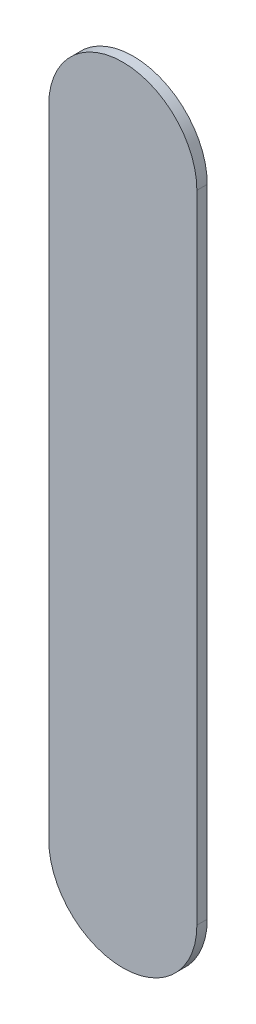
ISO-10303-21;
HEADER;
FILE_DESCRIPTION(('STEP AP214'),'2;1');
FILE_NAME('part.step','',(''),(''),'','','');
FILE_SCHEMA(('AUTOMOTIVE_DESIGN { 1 0 10303 214 1 1 1 1 }'));
ENDSEC;
DATA;
#1=APPLICATION_CONTEXT('core data for automotive mechanical design processes');
#2=APPLICATION_PROTOCOL_DEFINITION('international standard','automotive_design',2000,#1);
#3=PRODUCT_CONTEXT('',#1,'mechanical');
#4=PRODUCT('Part','Part','',(#3));
#5=PRODUCT_RELATED_PRODUCT_CATEGORY('part','',(#4));
#6=PRODUCT_DEFINITION_FORMATION('','',#4);
#7=PRODUCT_DEFINITION_CONTEXT('part definition',#1,'design');
#8=PRODUCT_DEFINITION('design','',#6,#7);
#9=PRODUCT_DEFINITION_SHAPE('','',#8);
#10=(LENGTH_UNIT() NAMED_UNIT(*) SI_UNIT(.MILLI.,.METRE.));
#11=(NAMED_UNIT(*) PLANE_ANGLE_UNIT() SI_UNIT($,.RADIAN.));
#12=(NAMED_UNIT(*) SI_UNIT($,.STERADIAN.) SOLID_ANGLE_UNIT());
#13=UNCERTAINTY_MEASURE_WITH_UNIT(LENGTH_MEASURE(1.E-05),#10,'distance_accuracy_value','');
#14=(GEOMETRIC_REPRESENTATION_CONTEXT(3) GLOBAL_UNCERTAINTY_ASSIGNED_CONTEXT((#13)) GLOBAL_UNIT_ASSIGNED_CONTEXT((#10,
#11,#12)) REPRESENTATION_CONTEXT('',''));
#15=CARTESIAN_POINT('',(0.,0.,0.));
#16=DIRECTION('',(0.,0.,1.));
#17=DIRECTION('',(1.,0.,0.));
#18=AXIS2_PLACEMENT_3D('',#15,#16,#17);
#19=CARTESIAN_POINT('',(96.93,-103.430001,1.635));
#20=DIRECTION('',(0.,0.,1.));
#21=DIRECTION('',(1.,0.,0.));
#22=AXIS2_PLACEMENT_3D('',#19,#20,#21);
#23=PLANE('',#22);
#24=DIRECTION('',(0.,1.,0.));
#25=VECTOR('',#24,1.);
#26=CARTESIAN_POINT('',(96.93,-103.430001,1.635));
#27=LINE('',#26,#25);
#28=CARTESIAN_POINT('',(96.93,-103.430001,1.635));
#29=VERTEX_POINT('',#28);
#30=CARTESIAN_POINT('',(96.93,-101.282,1.635));
#31=VERTEX_POINT('',#30);
#32=EDGE_CURVE('E88',#29,#31,#27,.T.);
#33=ORIENTED_EDGE('',*,*,#32,.T.);
#34=CARTESIAN_POINT('',(96.68,-101.282,1.635));
#35=DIRECTION('',(0.,0.,1.));
#36=DIRECTION('',(1.,0.,0.));
#37=AXIS2_PLACEMENT_3D('',#34,#35,#36);
#38=CIRCLE('',#37,0.25);
#39=CARTESIAN_POINT('',(96.43,-101.282,1.635));
#40=VERTEX_POINT('',#39);
#41=EDGE_CURVE('E104',#31,#40,#38,.T.);
#42=ORIENTED_EDGE('',*,*,#41,.T.);
#43=DIRECTION('',(0.,-1.,0.));
#44=VECTOR('',#43,1.);
#45=CARTESIAN_POINT('',(96.43,-101.282,1.635));
#46=LINE('',#45,#44);
#47=CARTESIAN_POINT('',(96.43,-103.430001,1.635));
#48=VERTEX_POINT('',#47);
#49=EDGE_CURVE('E50',#40,#48,#46,.T.);
#50=ORIENTED_EDGE('',*,*,#49,.T.);
#51=CARTESIAN_POINT('',(96.68,-103.430001,1.635));
#52=DIRECTION('',(0.,0.,1.));
#53=DIRECTION('',(-1.,0.,0.));
#54=AXIS2_PLACEMENT_3D('',#51,#52,#53);
#55=CIRCLE('',#54,0.25);
#56=EDGE_CURVE('E11',#48,#29,#55,.T.);
#57=ORIENTED_EDGE('',*,*,#56,.T.);
#58=EDGE_LOOP('',(#33,#42,#50,#57));
#59=FACE_BOUND('',#58,.T.);
#60=ADVANCED_FACE('F17',(#59),#23,.T.);
#61=CARTESIAN_POINT('',(96.93,-103.430001,1.6));
#62=DIRECTION('',(0.,0.,1.));
#63=DIRECTION('',(1.,0.,0.));
#64=AXIS2_PLACEMENT_3D('',#61,#62,#63);
#65=PLANE('',#64);
#66=CARTESIAN_POINT('',(96.68,-103.430001,1.6));
#67=DIRECTION('',(0.,0.,1.));
#68=DIRECTION('',(-1.,0.,0.));
#69=AXIS2_PLACEMENT_3D('',#66,#67,#68);
#70=CIRCLE('',#69,0.25);
#71=CARTESIAN_POINT('',(96.43,-103.430001,1.6));
#72=VERTEX_POINT('',#71);
#73=CARTESIAN_POINT('',(96.93,-103.430001,1.6));
#74=VERTEX_POINT('',#73);
#75=EDGE_CURVE('E20',#72,#74,#70,.T.);
#76=ORIENTED_EDGE('',*,*,#75,.F.);
#77=DIRECTION('',(0.,-1.,0.));
#78=VECTOR('',#77,1.);
#79=CARTESIAN_POINT('',(96.43,-101.282,1.6));
#80=LINE('',#79,#78);
#81=CARTESIAN_POINT('',(96.43,-101.282,1.6));
#82=VERTEX_POINT('',#81);
#83=EDGE_CURVE('E59',#82,#72,#80,.T.);
#84=ORIENTED_EDGE('',*,*,#83,.F.);
#85=CARTESIAN_POINT('',(96.68,-101.282,1.6));
#86=DIRECTION('',(0.,0.,1.));
#87=DIRECTION('',(1.,0.,0.));
#88=AXIS2_PLACEMENT_3D('',#85,#86,#87);
#89=CIRCLE('',#88,0.25);
#90=CARTESIAN_POINT('',(96.93,-101.282,1.6));
#91=VERTEX_POINT('',#90);
#92=EDGE_CURVE('E90',#91,#82,#89,.T.);
#93=ORIENTED_EDGE('',*,*,#92,.F.);
#94=DIRECTION('',(0.,1.,0.));
#95=VECTOR('',#94,1.);
#96=CARTESIAN_POINT('',(96.93,-103.430001,1.6));
#97=LINE('',#96,#95);
#98=EDGE_CURVE('E87',#74,#91,#97,.T.);
#99=ORIENTED_EDGE('',*,*,#98,.F.);
#100=EDGE_LOOP('',(#76,#84,#93,#99));
#101=FACE_BOUND('',#100,.T.);
#102=ADVANCED_FACE('F92',(#101),#65,.F.);
#103=CARTESIAN_POINT('',(96.68,-103.430001,1.6));
#104=DIRECTION('',(0.,0.,-1.));
#105=DIRECTION('',(-1.,0.,0.));
#106=AXIS2_PLACEMENT_3D('',#103,#104,#105);
#107=CYLINDRICAL_SURFACE('',#106,0.25);
#108=ORIENTED_EDGE('',*,*,#75,.T.);
#109=DIRECTION('',(0.,0.,1.));
#110=VECTOR('',#109,1.);
#111=CARTESIAN_POINT('',(96.93,-103.430001,1.6));
#112=LINE('',#111,#110);
#113=EDGE_CURVE('E78',#74,#29,#112,.T.);
#114=ORIENTED_EDGE('',*,*,#113,.T.);
#115=ORIENTED_EDGE('',*,*,#56,.F.);
#116=DIRECTION('',(0.,0.,1.));
#117=VECTOR('',#116,1.);
#118=CARTESIAN_POINT('',(96.43,-103.430001,1.6));
#119=LINE('',#118,#117);
#120=EDGE_CURVE('E80',#72,#48,#119,.T.);
#121=ORIENTED_EDGE('',*,*,#120,.F.);
#122=EDGE_LOOP('',(#108,#114,#115,#121));
#123=FACE_BOUND('',#122,.T.);
#124=ADVANCED_FACE('F77',(#123),#107,.T.);
#125=CARTESIAN_POINT('',(96.43,-101.282,1.6));
#126=DIRECTION('',(1.,0.,0.));
#127=DIRECTION('',(0.,1.,0.));
#128=AXIS2_PLACEMENT_3D('',#125,#126,#127);
#129=PLANE('',#128);
#130=ORIENTED_EDGE('',*,*,#83,.T.);
#131=ORIENTED_EDGE('',*,*,#120,.T.);
#132=ORIENTED_EDGE('',*,*,#49,.F.);
#133=DIRECTION('',(0.,0.,1.));
#134=VECTOR('',#133,1.);
#135=CARTESIAN_POINT('',(96.43,-101.282,1.6));
#136=LINE('',#135,#134);
#137=EDGE_CURVE('E106',#82,#40,#136,.T.);
#138=ORIENTED_EDGE('',*,*,#137,.F.);
#139=EDGE_LOOP('',(#130,#131,#132,#138));
#140=FACE_BOUND('',#139,.T.);
#141=ADVANCED_FACE('F121',(#140),#129,.F.);
#142=CARTESIAN_POINT('',(96.68,-101.282,1.6));
#143=DIRECTION('',(0.,0.,-1.));
#144=DIRECTION('',(1.,0.,0.));
#145=AXIS2_PLACEMENT_3D('',#142,#143,#144);
#146=CYLINDRICAL_SURFACE('',#145,0.25);
#147=ORIENTED_EDGE('',*,*,#92,.T.);
#148=ORIENTED_EDGE('',*,*,#137,.T.);
#149=ORIENTED_EDGE('',*,*,#41,.F.);
#150=DIRECTION('',(0.,0.,1.));
#151=VECTOR('',#150,1.);
#152=CARTESIAN_POINT('',(96.93,-101.282,1.6));
#153=LINE('',#152,#151);
#154=EDGE_CURVE('E96',#91,#31,#153,.T.);
#155=ORIENTED_EDGE('',*,*,#154,.F.);
#156=EDGE_LOOP('',(#147,#148,#149,#155));
#157=FACE_BOUND('',#156,.T.);
#158=ADVANCED_FACE('F123',(#157),#146,.T.);
#159=CARTESIAN_POINT('',(96.93,-103.430001,1.6));
#160=DIRECTION('',(-1.,0.,0.));
#161=DIRECTION('',(0.,0.,1.));
#162=AXIS2_PLACEMENT_3D('',#159,#160,#161);
#163=PLANE('',#162);
#164=ORIENTED_EDGE('',*,*,#98,.T.);
#165=ORIENTED_EDGE('',*,*,#154,.T.);
#166=ORIENTED_EDGE('',*,*,#32,.F.);
#167=ORIENTED_EDGE('',*,*,#113,.F.);
#168=EDGE_LOOP('',(#164,#165,#166,#167));
#169=FACE_BOUND('',#168,.T.);
#170=ADVANCED_FACE('F85',(#169),#163,.F.);
#171=CLOSED_SHELL('',(#60,#102,#124,#141,#158,#170));
#172=MANIFOLD_SOLID_BREP('B1',#171);
#173=ADVANCED_BREP_SHAPE_REPRESENTATION('',(#18,#172),#14);
#174=SHAPE_DEFINITION_REPRESENTATION(#9,#173);
ENDSEC;
END-ISO-10303-21;
